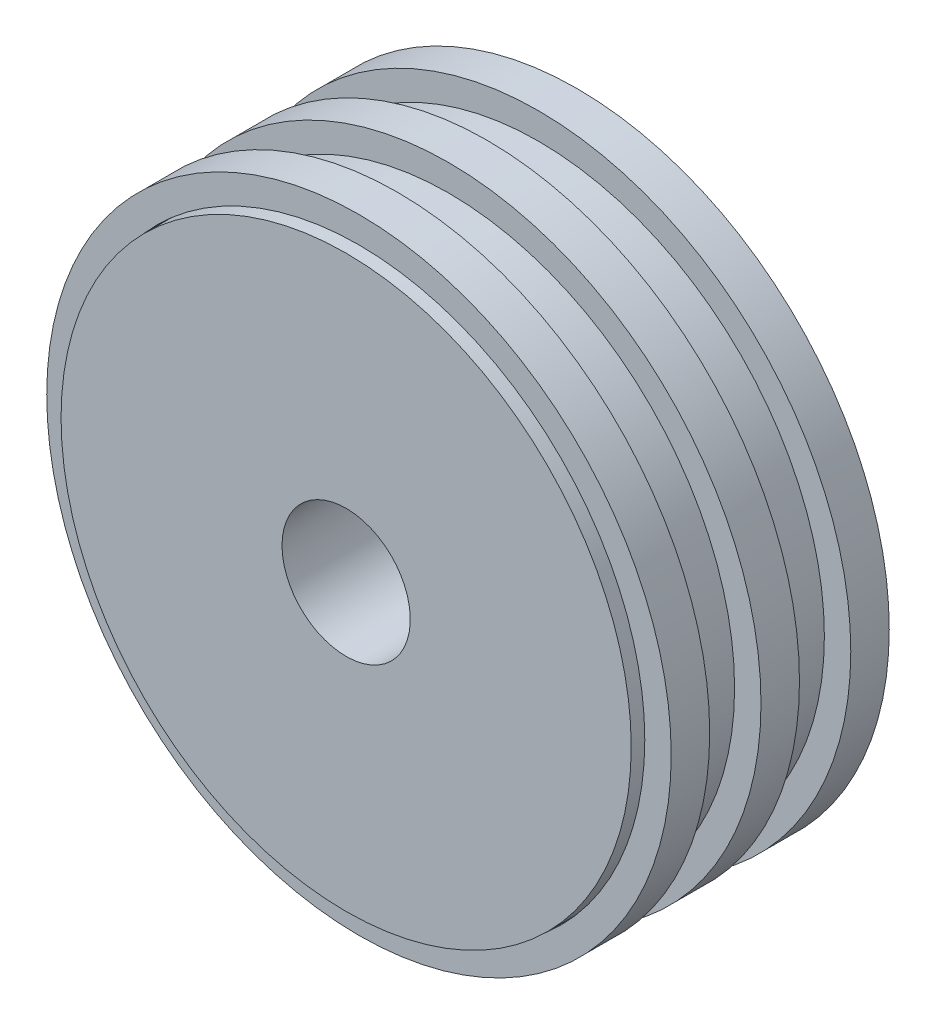
ISO-10303-21;
HEADER;
FILE_DESCRIPTION(('STEP AP214'),'2;1');
FILE_NAME('part.step','',(''),(''),'','','');
FILE_SCHEMA(('AUTOMOTIVE_DESIGN { 1 0 10303 214 1 1 1 1 }'));
ENDSEC;
DATA;
#1=APPLICATION_CONTEXT('core data for automotive mechanical design processes');
#2=APPLICATION_PROTOCOL_DEFINITION('international standard','automotive_design',2000,#1);
#3=PRODUCT_CONTEXT('',#1,'mechanical');
#4=PRODUCT('Part','Part','',(#3));
#5=PRODUCT_RELATED_PRODUCT_CATEGORY('part','',(#4));
#6=PRODUCT_DEFINITION_FORMATION('','',#4);
#7=PRODUCT_DEFINITION_CONTEXT('part definition',#1,'design');
#8=PRODUCT_DEFINITION('design','',#6,#7);
#9=PRODUCT_DEFINITION_SHAPE('','',#8);
#10=(LENGTH_UNIT() NAMED_UNIT(*) SI_UNIT(.MILLI.,.METRE.));
#11=(NAMED_UNIT(*) PLANE_ANGLE_UNIT() SI_UNIT($,.RADIAN.));
#12=(NAMED_UNIT(*) SI_UNIT($,.STERADIAN.) SOLID_ANGLE_UNIT());
#13=UNCERTAINTY_MEASURE_WITH_UNIT(LENGTH_MEASURE(1.E-05),#10,'distance_accuracy_value','');
#14=(GEOMETRIC_REPRESENTATION_CONTEXT(3) GLOBAL_UNCERTAINTY_ASSIGNED_CONTEXT((#13)) GLOBAL_UNIT_ASSIGNED_CONTEXT((#10,
#11,#12)) REPRESENTATION_CONTEXT('',''));
#15=CARTESIAN_POINT('',(0.,0.,0.));
#16=DIRECTION('',(0.,0.,1.));
#17=DIRECTION('',(1.,0.,0.));
#18=AXIS2_PLACEMENT_3D('',#15,#16,#17);
#19=CARTESIAN_POINT('',(0.,0.,3.));
#20=DIRECTION('',(0.,0.,1.));
#21=DIRECTION('',(1.,0.,0.));
#22=AXIS2_PLACEMENT_3D('',#19,#20,#21);
#23=CYLINDRICAL_SURFACE('',#22,73.025);
#24=CARTESIAN_POINT('',(0.,0.,3.));
#25=DIRECTION('',(0.,0.,1.));
#26=DIRECTION('',(1.,0.,0.));
#27=AXIS2_PLACEMENT_3D('',#24,#25,#26);
#28=CIRCLE('',#27,73.025);
#29=CARTESIAN_POINT('',(73.025,0.,3.));
#30=VERTEX_POINT('',#29);
#31=EDGE_CURVE('E11',#30,#30,#28,.T.);
#32=ORIENTED_EDGE('',*,*,#31,.T.);
#33=EDGE_LOOP('',(#32));
#34=FACE_BOUND('',#33,.T.);
#35=CARTESIAN_POINT('',(0.,0.,12.));
#36=DIRECTION('',(0.,0.,1.));
#37=DIRECTION('',(1.,0.,0.));
#38=AXIS2_PLACEMENT_3D('',#35,#36,#37);
#39=CIRCLE('',#38,73.025);
#40=CARTESIAN_POINT('',(73.025,0.,12.));
#41=VERTEX_POINT('',#40);
#42=EDGE_CURVE('E43',#41,#41,#39,.T.);
#43=ORIENTED_EDGE('',*,*,#42,.F.);
#44=EDGE_LOOP('',(#43));
#45=FACE_BOUND('',#44,.T.);
#46=ADVANCED_FACE('F40',(#34,#45),#23,.T.);
#47=CARTESIAN_POINT('',(0.,0.,3.));
#48=DIRECTION('',(0.,0.,1.));
#49=DIRECTION('',(1.,0.,0.));
#50=AXIS2_PLACEMENT_3D('',#47,#48,#49);
#51=PLANE('',#50);
#52=CARTESIAN_POINT('',(0.,0.,3.));
#53=DIRECTION('',(0.,0.,1.));
#54=DIRECTION('',(1.,0.,0.));
#55=AXIS2_PLACEMENT_3D('',#52,#53,#54);
#56=CIRCLE('',#55,66.8498818927834);
#57=CARTESIAN_POINT('',(66.8498818927834,0.,3.));
#58=VERTEX_POINT('',#57);
#59=EDGE_CURVE('E50',#58,#58,#56,.T.);
#60=ORIENTED_EDGE('',*,*,#59,.T.);
#61=EDGE_LOOP('',(#60));
#62=FACE_BOUND('',#61,.T.);
#63=ORIENTED_EDGE('',*,*,#31,.F.);
#64=EDGE_LOOP('',(#63));
#65=FACE_BOUND('',#64,.T.);
#66=ADVANCED_FACE('F58',(#62,#65),#51,.F.);
#67=CARTESIAN_POINT('',(0.,0.,12.));
#68=DIRECTION('',(0.,0.,1.));
#69=DIRECTION('',(1.,0.,0.));
#70=AXIS2_PLACEMENT_3D('',#67,#68,#69);
#71=PLANE('',#70);
#72=CARTESIAN_POINT('',(0.,0.,12.));
#73=DIRECTION('',(0.,0.,1.));
#74=DIRECTION('',(1.,0.,0.));
#75=AXIS2_PLACEMENT_3D('',#72,#73,#74);
#76=CIRCLE('',#75,66.8498818927834);
#77=CARTESIAN_POINT('',(66.8498818927834,0.,12.));
#78=VERTEX_POINT('',#77);
#79=EDGE_CURVE('E52',#78,#78,#76,.T.);
#80=ORIENTED_EDGE('',*,*,#79,.F.);
#81=EDGE_LOOP('',(#80));
#82=FACE_BOUND('',#81,.T.);
#83=ORIENTED_EDGE('',*,*,#42,.T.);
#84=EDGE_LOOP('',(#83));
#85=FACE_BOUND('',#84,.T.);
#86=ADVANCED_FACE('F64',(#82,#85),#71,.T.);
#87=CARTESIAN_POINT('',(0.,0.,3.));
#88=DIRECTION('',(0.,0.,1.));
#89=DIRECTION('',(1.,0.,0.));
#90=AXIS2_PLACEMENT_3D('',#87,#88,#89);
#91=CYLINDRICAL_SURFACE('',#90,66.8498818927834);
#92=ORIENTED_EDGE('',*,*,#59,.F.);
#93=EDGE_LOOP('',(#92));
#94=FACE_BOUND('',#93,.T.);
#95=ORIENTED_EDGE('',*,*,#79,.T.);
#96=EDGE_LOOP('',(#95));
#97=FACE_BOUND('',#96,.T.);
#98=ADVANCED_FACE('F61',(#94,#97),#91,.F.);
#99=CLOSED_SHELL('',(#46,#66,#86,#98));
#100=MANIFOLD_SOLID_BREP('B2',#99);
#101=CARTESIAN_POINT('',(0.,0.,24.));
#102=DIRECTION('',(0.,0.,1.));
#103=DIRECTION('',(1.,0.,0.));
#104=AXIS2_PLACEMENT_3D('',#101,#102,#103);
#105=CYLINDRICAL_SURFACE('',#104,73.025);
#106=CARTESIAN_POINT('',(0.,0.,24.));
#107=DIRECTION('',(0.,0.,1.));
#108=DIRECTION('',(1.,0.,0.));
#109=AXIS2_PLACEMENT_3D('',#106,#107,#108);
#110=CIRCLE('',#109,73.025);
#111=CARTESIAN_POINT('',(73.025,0.,24.));
#112=VERTEX_POINT('',#111);
#113=EDGE_CURVE('E39',#112,#112,#110,.T.);
#114=ORIENTED_EDGE('',*,*,#113,.T.);
#115=EDGE_LOOP('',(#114));
#116=FACE_BOUND('',#115,.T.);
#117=CARTESIAN_POINT('',(0.,0.,33.));
#118=DIRECTION('',(0.,0.,1.));
#119=DIRECTION('',(1.,0.,0.));
#120=AXIS2_PLACEMENT_3D('',#117,#118,#119);
#121=CIRCLE('',#120,73.025);
#122=CARTESIAN_POINT('',(73.025,0.,33.));
#123=VERTEX_POINT('',#122);
#124=EDGE_CURVE('E113',#123,#123,#121,.T.);
#125=ORIENTED_EDGE('',*,*,#124,.F.);
#126=EDGE_LOOP('',(#125));
#127=FACE_BOUND('',#126,.T.);
#128=ADVANCED_FACE('F110',(#116,#127),#105,.T.);
#129=CARTESIAN_POINT('',(0.,0.,24.));
#130=DIRECTION('',(0.,0.,1.));
#131=DIRECTION('',(1.,0.,0.));
#132=AXIS2_PLACEMENT_3D('',#129,#130,#131);
#133=PLANE('',#132);
#134=CARTESIAN_POINT('',(0.,0.,24.));
#135=DIRECTION('',(0.,0.,1.));
#136=DIRECTION('',(1.,0.,0.));
#137=AXIS2_PLACEMENT_3D('',#134,#135,#136);
#138=CIRCLE('',#137,66.8498818927834);
#139=CARTESIAN_POINT('',(66.8498818927834,0.,24.));
#140=VERTEX_POINT('',#139);
#141=EDGE_CURVE('E120',#140,#140,#138,.T.);
#142=ORIENTED_EDGE('',*,*,#141,.T.);
#143=EDGE_LOOP('',(#142));
#144=FACE_BOUND('',#143,.T.);
#145=ORIENTED_EDGE('',*,*,#113,.F.);
#146=EDGE_LOOP('',(#145));
#147=FACE_BOUND('',#146,.T.);
#148=ADVANCED_FACE('F128',(#144,#147),#133,.F.);
#149=CARTESIAN_POINT('',(0.,0.,33.));
#150=DIRECTION('',(0.,0.,1.));
#151=DIRECTION('',(1.,0.,0.));
#152=AXIS2_PLACEMENT_3D('',#149,#150,#151);
#153=PLANE('',#152);
#154=CARTESIAN_POINT('',(0.,0.,33.));
#155=DIRECTION('',(0.,0.,1.));
#156=DIRECTION('',(1.,0.,0.));
#157=AXIS2_PLACEMENT_3D('',#154,#155,#156);
#158=CIRCLE('',#157,66.8498818927834);
#159=CARTESIAN_POINT('',(66.8498818927834,0.,33.));
#160=VERTEX_POINT('',#159);
#161=EDGE_CURVE('E122',#160,#160,#158,.T.);
#162=ORIENTED_EDGE('',*,*,#161,.F.);
#163=EDGE_LOOP('',(#162));
#164=FACE_BOUND('',#163,.T.);
#165=ORIENTED_EDGE('',*,*,#124,.T.);
#166=EDGE_LOOP('',(#165));
#167=FACE_BOUND('',#166,.T.);
#168=ADVANCED_FACE('F134',(#164,#167),#153,.T.);
#169=CARTESIAN_POINT('',(0.,0.,24.));
#170=DIRECTION('',(0.,0.,1.));
#171=DIRECTION('',(1.,0.,0.));
#172=AXIS2_PLACEMENT_3D('',#169,#170,#171);
#173=CYLINDRICAL_SURFACE('',#172,66.8498818927834);
#174=ORIENTED_EDGE('',*,*,#141,.F.);
#175=EDGE_LOOP('',(#174));
#176=FACE_BOUND('',#175,.T.);
#177=ORIENTED_EDGE('',*,*,#161,.T.);
#178=EDGE_LOOP('',(#177));
#179=FACE_BOUND('',#178,.T.);
#180=ADVANCED_FACE('F131',(#176,#179),#173,.F.);
#181=CLOSED_SHELL('',(#128,#148,#168,#180));
#182=MANIFOLD_SOLID_BREP('B6',#181);
#183=CARTESIAN_POINT('',(0.,0.,45.));
#184=DIRECTION('',(0.,0.,1.));
#185=DIRECTION('',(1.,0.,0.));
#186=AXIS2_PLACEMENT_3D('',#183,#184,#185);
#187=CYLINDRICAL_SURFACE('',#186,73.025);
#188=CARTESIAN_POINT('',(0.,0.,45.));
#189=DIRECTION('',(0.,0.,1.));
#190=DIRECTION('',(1.,0.,0.));
#191=AXIS2_PLACEMENT_3D('',#188,#189,#190);
#192=CIRCLE('',#191,73.025);
#193=CARTESIAN_POINT('',(73.025,0.,45.));
#194=VERTEX_POINT('',#193);
#195=EDGE_CURVE('E109',#194,#194,#192,.T.);
#196=ORIENTED_EDGE('',*,*,#195,.T.);
#197=EDGE_LOOP('',(#196));
#198=FACE_BOUND('',#197,.T.);
#199=CARTESIAN_POINT('',(0.,0.,54.));
#200=DIRECTION('',(0.,0.,1.));
#201=DIRECTION('',(1.,0.,0.));
#202=AXIS2_PLACEMENT_3D('',#199,#200,#201);
#203=CIRCLE('',#202,73.025);
#204=CARTESIAN_POINT('',(73.025,0.,54.));
#205=VERTEX_POINT('',#204);
#206=EDGE_CURVE('E182',#205,#205,#203,.T.);
#207=ORIENTED_EDGE('',*,*,#206,.F.);
#208=EDGE_LOOP('',(#207));
#209=FACE_BOUND('',#208,.T.);
#210=ADVANCED_FACE('F179',(#198,#209),#187,.T.);
#211=CARTESIAN_POINT('',(0.,0.,45.));
#212=DIRECTION('',(0.,0.,1.));
#213=DIRECTION('',(1.,0.,0.));
#214=AXIS2_PLACEMENT_3D('',#211,#212,#213);
#215=PLANE('',#214);
#216=CARTESIAN_POINT('',(0.,0.,45.));
#217=DIRECTION('',(0.,0.,1.));
#218=DIRECTION('',(1.,0.,0.));
#219=AXIS2_PLACEMENT_3D('',#216,#217,#218);
#220=CIRCLE('',#219,66.8498818927834);
#221=CARTESIAN_POINT('',(66.8498818927834,0.,45.));
#222=VERTEX_POINT('',#221);
#223=EDGE_CURVE('E189',#222,#222,#220,.T.);
#224=ORIENTED_EDGE('',*,*,#223,.T.);
#225=EDGE_LOOP('',(#224));
#226=FACE_BOUND('',#225,.T.);
#227=ORIENTED_EDGE('',*,*,#195,.F.);
#228=EDGE_LOOP('',(#227));
#229=FACE_BOUND('',#228,.T.);
#230=ADVANCED_FACE('F197',(#226,#229),#215,.F.);
#231=CARTESIAN_POINT('',(0.,0.,54.));
#232=DIRECTION('',(0.,0.,1.));
#233=DIRECTION('',(1.,0.,0.));
#234=AXIS2_PLACEMENT_3D('',#231,#232,#233);
#235=PLANE('',#234);
#236=CARTESIAN_POINT('',(0.,0.,54.));
#237=DIRECTION('',(0.,0.,1.));
#238=DIRECTION('',(1.,0.,0.));
#239=AXIS2_PLACEMENT_3D('',#236,#237,#238);
#240=CIRCLE('',#239,66.8498818927834);
#241=CARTESIAN_POINT('',(66.8498818927834,0.,54.));
#242=VERTEX_POINT('',#241);
#243=EDGE_CURVE('E191',#242,#242,#240,.T.);
#244=ORIENTED_EDGE('',*,*,#243,.F.);
#245=EDGE_LOOP('',(#244));
#246=FACE_BOUND('',#245,.T.);
#247=ORIENTED_EDGE('',*,*,#206,.T.);
#248=EDGE_LOOP('',(#247));
#249=FACE_BOUND('',#248,.T.);
#250=ADVANCED_FACE('F203',(#246,#249),#235,.T.);
#251=CARTESIAN_POINT('',(0.,0.,45.));
#252=DIRECTION('',(0.,0.,1.));
#253=DIRECTION('',(1.,0.,0.));
#254=AXIS2_PLACEMENT_3D('',#251,#252,#253);
#255=CYLINDRICAL_SURFACE('',#254,66.8498818927834);
#256=ORIENTED_EDGE('',*,*,#223,.F.);
#257=EDGE_LOOP('',(#256));
#258=FACE_BOUND('',#257,.T.);
#259=ORIENTED_EDGE('',*,*,#243,.T.);
#260=EDGE_LOOP('',(#259));
#261=FACE_BOUND('',#260,.T.);
#262=ADVANCED_FACE('F200',(#258,#261),#255,.F.);
#263=CLOSED_SHELL('',(#210,#230,#250,#262));
#264=MANIFOLD_SOLID_BREP('B34',#263);
#265=CARTESIAN_POINT('',(0.,0.,57.));
#266=DIRECTION('',(0.,0.,1.));
#267=DIRECTION('',(1.,0.,0.));
#268=AXIS2_PLACEMENT_3D('',#265,#266,#267);
#269=PLANE('',#268);
#270=CARTESIAN_POINT('',(0.,0.,57.));
#271=DIRECTION('',(0.,0.,1.));
#272=DIRECTION('',(1.,0.,0.));
#273=AXIS2_PLACEMENT_3D('',#270,#271,#272);
#274=CIRCLE('',#273,66.675);
#275=CARTESIAN_POINT('',(-66.675,0.,57.));
#276=VERTEX_POINT('',#275);
#277=EDGE_CURVE('E178',#276,#276,#274,.T.);
#278=ORIENTED_EDGE('',*,*,#277,.T.);
#279=EDGE_LOOP('',(#278));
#280=FACE_BOUND('',#279,.T.);
#281=CARTESIAN_POINT('',(0.,0.,57.));
#282=DIRECTION('',(0.,0.,1.));
#283=DIRECTION('',(1.,0.,0.));
#284=AXIS2_PLACEMENT_3D('',#281,#282,#283);
#285=CIRCLE('',#284,15.);
#286=CARTESIAN_POINT('',(-15.,0.,57.));
#287=VERTEX_POINT('',#286);
#288=EDGE_CURVE('E252',#287,#287,#285,.T.);
#289=ORIENTED_EDGE('',*,*,#288,.F.);
#290=EDGE_LOOP('',(#289));
#291=FACE_BOUND('',#290,.T.);
#292=ADVANCED_FACE('F241',(#280,#291),#269,.T.);
#293=CARTESIAN_POINT('',(0.,0.,0.));
#294=DIRECTION('',(0.,0.,1.));
#295=DIRECTION('',(1.,0.,0.));
#296=AXIS2_PLACEMENT_3D('',#293,#294,#295);
#297=PLANE('',#296);
#298=CARTESIAN_POINT('',(0.,0.,0.));
#299=DIRECTION('',(0.,0.,1.));
#300=DIRECTION('',(1.,0.,0.));
#301=AXIS2_PLACEMENT_3D('',#298,#299,#300);
#302=CIRCLE('',#301,66.675);
#303=CARTESIAN_POINT('',(-66.675,0.,0.));
#304=VERTEX_POINT('',#303);
#305=EDGE_CURVE('E245',#304,#304,#302,.T.);
#306=ORIENTED_EDGE('',*,*,#305,.F.);
#307=EDGE_LOOP('',(#306));
#308=FACE_BOUND('',#307,.T.);
#309=CARTESIAN_POINT('',(0.,0.,0.));
#310=DIRECTION('',(0.,0.,1.));
#311=DIRECTION('',(1.,0.,0.));
#312=AXIS2_PLACEMENT_3D('',#309,#310,#311);
#313=CIRCLE('',#312,15.);
#314=CARTESIAN_POINT('',(-15.,0.,0.));
#315=VERTEX_POINT('',#314);
#316=EDGE_CURVE('E254',#315,#315,#313,.T.);
#317=ORIENTED_EDGE('',*,*,#316,.T.);
#318=EDGE_LOOP('',(#317));
#319=FACE_BOUND('',#318,.T.);
#320=ADVANCED_FACE('F264',(#308,#319),#297,.F.);
#321=CARTESIAN_POINT('',(0.,0.,57.));
#322=DIRECTION('',(0.,0.,-1.));
#323=DIRECTION('',(-1.,0.,0.));
#324=AXIS2_PLACEMENT_3D('',#321,#322,#323);
#325=CYLINDRICAL_SURFACE('',#324,66.675);
#326=CARTESIAN_POINT('',(-66.675,0.,57.));
#327=CARTESIAN_POINT('',(-66.675,0.,56.40625));
#328=CARTESIAN_POINT('',(-66.675,0.,55.8125));
#329=CARTESIAN_POINT('',(-66.675,0.,54.625));
#330=CARTESIAN_POINT('',(-66.675,0.,54.03125));
#331=CARTESIAN_POINT('',(-66.675,0.,52.84375));
#332=CARTESIAN_POINT('',(-66.675,0.,52.25));
#333=CARTESIAN_POINT('',(-66.675,0.,51.0625));
#334=CARTESIAN_POINT('',(-66.675,0.,50.46875));
#335=CARTESIAN_POINT('',(-66.675,0.,49.28125));
#336=CARTESIAN_POINT('',(-66.675,0.,48.6875));
#337=CARTESIAN_POINT('',(-66.675,0.,47.5));
#338=CARTESIAN_POINT('',(-66.675,0.,46.90625));
#339=CARTESIAN_POINT('',(-66.675,0.,45.71875));
#340=CARTESIAN_POINT('',(-66.675,0.,45.125));
#341=CARTESIAN_POINT('',(-66.675,0.,43.9375));
#342=CARTESIAN_POINT('',(-66.675,0.,43.34375));
#343=CARTESIAN_POINT('',(-66.675,0.,42.15625));
#344=CARTESIAN_POINT('',(-66.675,0.,41.5625));
#345=CARTESIAN_POINT('',(-66.675,0.,40.375));
#346=CARTESIAN_POINT('',(-66.675,0.,39.78125));
#347=CARTESIAN_POINT('',(-66.675,0.,38.59375));
#348=CARTESIAN_POINT('',(-66.675,0.,38.));
#349=CARTESIAN_POINT('',(-66.675,0.,36.8125));
#350=CARTESIAN_POINT('',(-66.675,0.,36.21875));
#351=CARTESIAN_POINT('',(-66.675,0.,35.03125));
#352=CARTESIAN_POINT('',(-66.675,0.,34.4375));
#353=CARTESIAN_POINT('',(-66.675,0.,33.25));
#354=CARTESIAN_POINT('',(-66.675,0.,32.65625));
#355=CARTESIAN_POINT('',(-66.675,0.,31.46875));
#356=CARTESIAN_POINT('',(-66.675,0.,30.875));
#357=CARTESIAN_POINT('',(-66.675,0.,29.6875));
#358=CARTESIAN_POINT('',(-66.675,0.,29.09375));
#359=CARTESIAN_POINT('',(-66.675,0.,27.90625));
#360=CARTESIAN_POINT('',(-66.675,0.,27.3125));
#361=CARTESIAN_POINT('',(-66.675,0.,26.125));
#362=CARTESIAN_POINT('',(-66.675,0.,25.53125));
#363=CARTESIAN_POINT('',(-66.675,0.,24.34375));
#364=CARTESIAN_POINT('',(-66.675,0.,23.75));
#365=CARTESIAN_POINT('',(-66.675,0.,22.5625));
#366=CARTESIAN_POINT('',(-66.675,0.,21.96875));
#367=CARTESIAN_POINT('',(-66.675,0.,20.78125));
#368=CARTESIAN_POINT('',(-66.675,0.,20.1875));
#369=CARTESIAN_POINT('',(-66.675,0.,19.));
#370=CARTESIAN_POINT('',(-66.675,0.,18.40625));
#371=CARTESIAN_POINT('',(-66.675,0.,17.21875));
#372=CARTESIAN_POINT('',(-66.675,0.,16.625));
#373=CARTESIAN_POINT('',(-66.675,0.,15.4375));
#374=CARTESIAN_POINT('',(-66.675,0.,14.84375));
#375=CARTESIAN_POINT('',(-66.675,0.,13.65625));
#376=CARTESIAN_POINT('',(-66.675,0.,13.0625));
#377=CARTESIAN_POINT('',(-66.675,0.,11.875));
#378=CARTESIAN_POINT('',(-66.675,0.,11.28125));
#379=CARTESIAN_POINT('',(-66.675,0.,10.09375));
#380=CARTESIAN_POINT('',(-66.675,0.,9.5));
#381=CARTESIAN_POINT('',(-66.675,0.,8.3125));
#382=CARTESIAN_POINT('',(-66.675,0.,7.71875));
#383=CARTESIAN_POINT('',(-66.675,0.,6.53125));
#384=CARTESIAN_POINT('',(-66.675,0.,5.9375));
#385=CARTESIAN_POINT('',(-66.675,0.,4.75));
#386=CARTESIAN_POINT('',(-66.675,0.,4.15625));
#387=CARTESIAN_POINT('',(-66.675,0.,2.96875));
#388=CARTESIAN_POINT('',(-66.675,0.,2.375));
#389=CARTESIAN_POINT('',(-66.675,0.,1.1875));
#390=CARTESIAN_POINT('',(-66.675,0.,0.593749999999999));
#391=CARTESIAN_POINT('',(-66.675,0.,0.));
#392=B_SPLINE_CURVE_WITH_KNOTS('',3,(#326,#327,#328,#329,#330,#331,#332,#333,#334,#335,#336,
#337,#338,#339,#340,#341,#342,#343,#344,#345,#346,#347,#348,#349,#350,#351,#352,#353,#354,#355,
#356,#357,#358,#359,#360,#361,#362,#363,#364,#365,#366,#367,#368,#369,#370,#371,#372,#373,#374,
#375,#376,#377,#378,#379,#380,#381,#382,#383,#384,#385,#386,#387,#388,#389,#390,#391),
.UNSPECIFIED.,.F.,.F.,(4,2,2,2,2,2,2,2,2,2,2,2,2,2,2,2,2,2,2,2,2,2,2,2,2,2,2,2,2,2,2,2,4),(0.,
1.78125000000001,3.5625,5.34375,7.12500000000001,8.90625,10.6875,12.46875,14.25,16.03125,
17.8125,19.59375,21.375,23.15625,24.9375,26.71875,28.5,30.28125,32.0625,33.84375,35.625,
37.40625,39.1875,40.96875,42.75,44.53125,46.3125,48.09375,49.875,51.65625,53.4375,55.21875,57.),.UNSPECIFIED.);
#393=EDGE_CURVE('BSEAM243',#276,#304,#392,.T.);
#394=ORIENTED_EDGE('',*,*,#277,.F.);
#395=ORIENTED_EDGE('',*,*,#305,.T.);
#396=ORIENTED_EDGE('',*,*,#393,.T.);
#397=ORIENTED_EDGE('',*,*,#393,.F.);
#398=EDGE_LOOP('',(#394,#396,#395,#397));
#399=FACE_BOUND('',#398,.T.);
#400=ADVANCED_FACE('F243',(#399),#325,.T.);
#401=CARTESIAN_POINT('',(0.,0.,57.));
#402=DIRECTION('',(0.,0.,-1.));
#403=DIRECTION('',(-1.,0.,0.));
#404=AXIS2_PLACEMENT_3D('',#401,#402,#403);
#405=CYLINDRICAL_SURFACE('',#404,15.);
#406=CARTESIAN_POINT('',(-15.,0.,57.));
#407=CARTESIAN_POINT('',(-15.,0.,56.40625));
#408=CARTESIAN_POINT('',(-15.,0.,55.8125));
#409=CARTESIAN_POINT('',(-15.,0.,54.625));
#410=CARTESIAN_POINT('',(-15.,0.,54.03125));
#411=CARTESIAN_POINT('',(-15.,0.,52.84375));
#412=CARTESIAN_POINT('',(-15.,0.,52.25));
#413=CARTESIAN_POINT('',(-15.,0.,51.0625));
#414=CARTESIAN_POINT('',(-15.,0.,50.46875));
#415=CARTESIAN_POINT('',(-15.,0.,49.28125));
#416=CARTESIAN_POINT('',(-15.,0.,48.6875));
#417=CARTESIAN_POINT('',(-15.,0.,47.5));
#418=CARTESIAN_POINT('',(-15.,0.,46.90625));
#419=CARTESIAN_POINT('',(-15.,0.,45.71875));
#420=CARTESIAN_POINT('',(-15.,0.,45.125));
#421=CARTESIAN_POINT('',(-15.,0.,43.9375));
#422=CARTESIAN_POINT('',(-15.,0.,43.34375));
#423=CARTESIAN_POINT('',(-15.,0.,42.15625));
#424=CARTESIAN_POINT('',(-15.,0.,41.5625));
#425=CARTESIAN_POINT('',(-15.,0.,40.375));
#426=CARTESIAN_POINT('',(-15.,0.,39.78125));
#427=CARTESIAN_POINT('',(-15.,0.,38.59375));
#428=CARTESIAN_POINT('',(-15.,0.,38.));
#429=CARTESIAN_POINT('',(-15.,0.,36.8125));
#430=CARTESIAN_POINT('',(-15.,0.,36.21875));
#431=CARTESIAN_POINT('',(-15.,0.,35.03125));
#432=CARTESIAN_POINT('',(-15.,0.,34.4375));
#433=CARTESIAN_POINT('',(-15.,0.,33.25));
#434=CARTESIAN_POINT('',(-15.,0.,32.65625));
#435=CARTESIAN_POINT('',(-15.,0.,31.46875));
#436=CARTESIAN_POINT('',(-15.,0.,30.875));
#437=CARTESIAN_POINT('',(-15.,0.,29.6875));
#438=CARTESIAN_POINT('',(-15.,0.,29.09375));
#439=CARTESIAN_POINT('',(-15.,0.,27.90625));
#440=CARTESIAN_POINT('',(-15.,0.,27.3125));
#441=CARTESIAN_POINT('',(-15.,0.,26.125));
#442=CARTESIAN_POINT('',(-15.,0.,25.53125));
#443=CARTESIAN_POINT('',(-15.,0.,24.34375));
#444=CARTESIAN_POINT('',(-15.,0.,23.75));
#445=CARTESIAN_POINT('',(-15.,0.,22.5625));
#446=CARTESIAN_POINT('',(-15.,0.,21.96875));
#447=CARTESIAN_POINT('',(-15.,0.,20.78125));
#448=CARTESIAN_POINT('',(-15.,0.,20.1875));
#449=CARTESIAN_POINT('',(-15.,0.,19.));
#450=CARTESIAN_POINT('',(-15.,0.,18.40625));
#451=CARTESIAN_POINT('',(-15.,0.,17.21875));
#452=CARTESIAN_POINT('',(-15.,0.,16.625));
#453=CARTESIAN_POINT('',(-15.,0.,15.4375));
#454=CARTESIAN_POINT('',(-15.,0.,14.84375));
#455=CARTESIAN_POINT('',(-15.,0.,13.65625));
#456=CARTESIAN_POINT('',(-15.,0.,13.0625));
#457=CARTESIAN_POINT('',(-15.,0.,11.875));
#458=CARTESIAN_POINT('',(-15.,0.,11.28125));
#459=CARTESIAN_POINT('',(-15.,0.,10.09375));
#460=CARTESIAN_POINT('',(-15.,0.,9.5));
#461=CARTESIAN_POINT('',(-15.,0.,8.3125));
#462=CARTESIAN_POINT('',(-15.,0.,7.71875));
#463=CARTESIAN_POINT('',(-15.,0.,6.53125));
#464=CARTESIAN_POINT('',(-15.,0.,5.9375));
#465=CARTESIAN_POINT('',(-15.,0.,4.75));
#466=CARTESIAN_POINT('',(-15.,0.,4.15625));
#467=CARTESIAN_POINT('',(-15.,0.,2.96875));
#468=CARTESIAN_POINT('',(-15.,0.,2.375));
#469=CARTESIAN_POINT('',(-15.,0.,1.1875));
#470=CARTESIAN_POINT('',(-15.,0.,0.593749999999999));
#471=CARTESIAN_POINT('',(-15.,0.,0.));
#472=B_SPLINE_CURVE_WITH_KNOTS('',3,(#406,#407,#408,#409,#410,#411,#412,#413,#414,#415,#416,
#417,#418,#419,#420,#421,#422,#423,#424,#425,#426,#427,#428,#429,#430,#431,#432,#433,#434,#435,
#436,#437,#438,#439,#440,#441,#442,#443,#444,#445,#446,#447,#448,#449,#450,#451,#452,#453,#454,
#455,#456,#457,#458,#459,#460,#461,#462,#463,#464,#465,#466,#467,#468,#469,#470,#471),
.UNSPECIFIED.,.F.,.F.,(4,2,2,2,2,2,2,2,2,2,2,2,2,2,2,2,2,2,2,2,2,2,2,2,2,2,2,2,2,2,2,2,4),(0.,
1.78125000000001,3.5625,5.34375,7.12500000000001,8.90625,10.6875,12.46875,14.25,16.03125,
17.8125,19.59375,21.375,23.15625,24.9375,26.71875,28.5,30.28125,32.0625,33.84375,35.625,
37.40625,39.1875,40.96875,42.75,44.53125,46.3125,48.09375,49.875,51.65625,53.4375,55.21875,57.),.UNSPECIFIED.);
#473=EDGE_CURVE('BSEAM260',#287,#315,#472,.T.);
#474=ORIENTED_EDGE('',*,*,#288,.T.);
#475=ORIENTED_EDGE('',*,*,#316,.F.);
#476=ORIENTED_EDGE('',*,*,#473,.T.);
#477=ORIENTED_EDGE('',*,*,#473,.F.);
#478=EDGE_LOOP('',(#474,#476,#475,#477));
#479=FACE_BOUND('',#478,.T.);
#480=ADVANCED_FACE('F260',(#479),#405,.F.);
#481=CLOSED_SHELL('',(#292,#320,#400,#480));
#482=MANIFOLD_SOLID_BREP('B104',#481);
#483=ADVANCED_BREP_SHAPE_REPRESENTATION('',(#18,#100,#182,#264,#482),#14);
#484=SHAPE_DEFINITION_REPRESENTATION(#9,#483);
ENDSEC;
END-ISO-10303-21;
